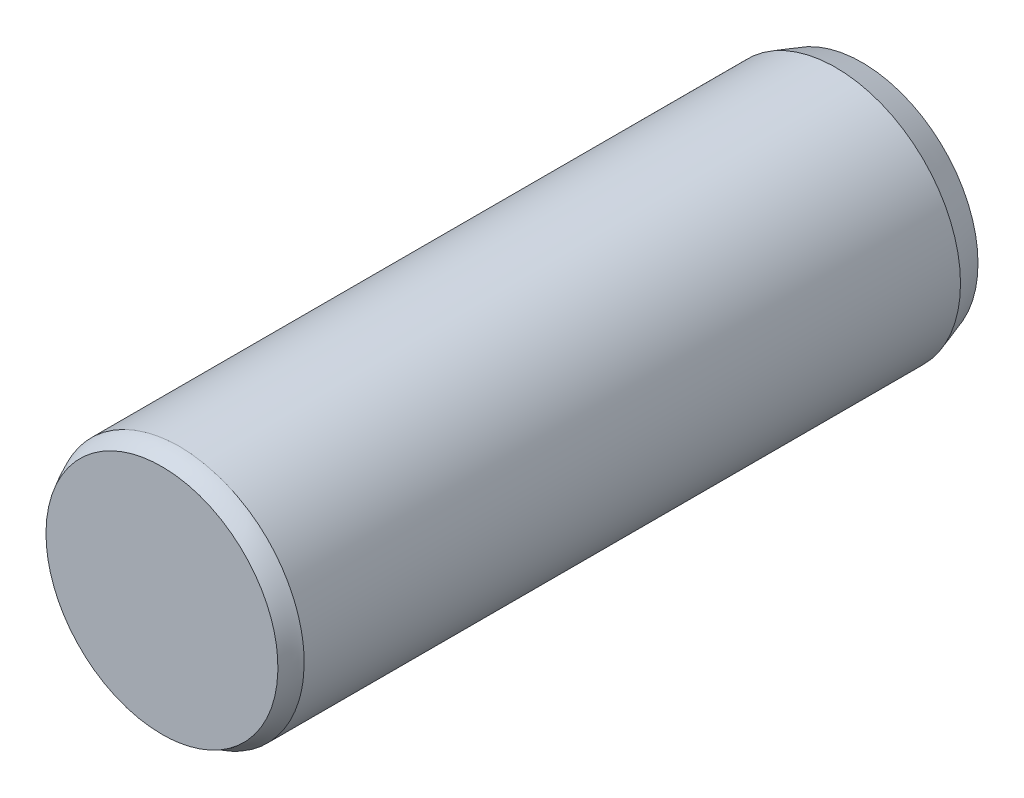
ISO-10303-21;
HEADER;
FILE_DESCRIPTION(('STEP AP214'),'2;1');
FILE_NAME('part.step','',(''),(''),'','','');
FILE_SCHEMA(('AUTOMOTIVE_DESIGN { 1 0 10303 214 1 1 1 1 }'));
ENDSEC;
DATA;
#1=APPLICATION_CONTEXT('core data for automotive mechanical design processes');
#2=APPLICATION_PROTOCOL_DEFINITION('international standard','automotive_design',2000,#1);
#3=PRODUCT_CONTEXT('',#1,'mechanical');
#4=PRODUCT('Part','Part','',(#3));
#5=PRODUCT_RELATED_PRODUCT_CATEGORY('part','',(#4));
#6=PRODUCT_DEFINITION_FORMATION('','',#4);
#7=PRODUCT_DEFINITION_CONTEXT('part definition',#1,'design');
#8=PRODUCT_DEFINITION('design','',#6,#7);
#9=PRODUCT_DEFINITION_SHAPE('','',#8);
#10=(LENGTH_UNIT() NAMED_UNIT(*) SI_UNIT(.MILLI.,.METRE.));
#11=(NAMED_UNIT(*) PLANE_ANGLE_UNIT() SI_UNIT($,.RADIAN.));
#12=(NAMED_UNIT(*) SI_UNIT($,.STERADIAN.) SOLID_ANGLE_UNIT());
#13=UNCERTAINTY_MEASURE_WITH_UNIT(LENGTH_MEASURE(1.E-05),#10,'distance_accuracy_value','');
#14=(GEOMETRIC_REPRESENTATION_CONTEXT(3) GLOBAL_UNCERTAINTY_ASSIGNED_CONTEXT((#13)) GLOBAL_UNIT_ASSIGNED_CONTEXT((#10,
#11,#12)) REPRESENTATION_CONTEXT('',''));
#15=CARTESIAN_POINT('',(0.,0.,0.));
#16=DIRECTION('',(0.,0.,1.));
#17=DIRECTION('',(1.,0.,0.));
#18=AXIS2_PLACEMENT_3D('',#15,#16,#17);
#19=CARTESIAN_POINT('',(0.,0.,-150.));
#20=DIRECTION('',(0.,0.,1.));
#21=DIRECTION('',(1.,0.,0.));
#22=AXIS2_PLACEMENT_3D('',#19,#20,#21);
#23=CYLINDRICAL_SURFACE('',#22,28.5);
#24=CARTESIAN_POINT('',(0.,0.,-150.));
#25=DIRECTION('',(0.,0.,1.));
#26=DIRECTION('',(1.,0.,0.));
#27=AXIS2_PLACEMENT_3D('',#24,#25,#26);
#28=CIRCLE('',#27,28.5);
#29=CARTESIAN_POINT('',(28.5,0.,-150.));
#30=VERTEX_POINT('',#29);
#31=EDGE_CURVE('E113',#30,#30,#28,.T.);
#32=ORIENTED_EDGE('',*,*,#31,.T.);
#33=EDGE_LOOP('',(#32));
#34=FACE_BOUND('',#33,.T.);
#35=CARTESIAN_POINT('',(0.,28.5,0.));
#36=CARTESIAN_POINT('',(0.685403881065248,28.4999974621461,-5.28809030770894E-06));
#37=CARTESIAN_POINT('',(1.3708806461371,28.475260016386,0.00306878781438999));
#38=CARTESIAN_POINT('',(2.73819556818574,28.3764373431519,0.0107953116492988));
#39=CARTESIAN_POINT('',(3.42003381571865,28.3023533496528,0.0154477201098152));
#40=CARTESIAN_POINT('',(4.77650699058129,28.1052411641767,0.0234275900641823));
#41=CARTESIAN_POINT('',(5.45114306351576,27.9822208789875,0.0267552654255539));
#42=CARTESIAN_POINT('',(6.7898044893632,27.687871657382,0.0308989835226916));
#43=CARTESIAN_POINT('',(7.45382974799033,27.5165422919517,0.0317150039526634));
#44=CARTESIAN_POINT('',(8.76774006291771,27.1264872074765,0.0308498409957288));
#45=CARTESIAN_POINT('',(9.41762647442937,26.9077660531653,0.0291688980228022));
#46=CARTESIAN_POINT('',(10.6999238813891,26.4240646643419,0.0240487922613334));
#47=CARTESIAN_POINT('',(11.3323352559646,26.15908543433,0.0206096676488127));
#48=CARTESIAN_POINT('',(12.5766301804993,25.5841399366828,0.0130210921716947));
#49=CARTESIAN_POINT('',(13.1885066702285,25.2741583877037,0.00887139993487579));
#50=CARTESIAN_POINT('',(14.3883580897187,24.6108747387459,0.000883238085759316));
#51=CARTESIAN_POINT('',(14.9763308669008,24.2575687487667,-0.00295520352859254));
#52=CARTESIAN_POINT('',(16.2219851637115,23.44650160723,-0.0101014731614439));
#53=CARTESIAN_POINT('',(16.8747554252676,22.9811667632607,-0.0132114322460841));
#54=CARTESIAN_POINT('',(18.1388368786517,21.9971430538108,-0.0174600333923661));
#55=CARTESIAN_POINT('',(18.7501436784115,21.4784485507426,-0.0185984669300947));
#56=CARTESIAN_POINT('',(19.9271148426963,20.3912263147817,-0.0190099804002163));
#57=CARTESIAN_POINT('',(20.4927632741799,19.8226813291138,-0.018282412046492));
#58=CARTESIAN_POINT('',(21.5741341374833,18.6399777333636,-0.015484100706862));
#59=CARTESIAN_POINT('',(22.0898578620115,18.0258203050597,-0.0134133925097851));
#60=CARTESIAN_POINT('',(23.0676102346926,16.7564032457231,-0.00866156773661857));
#61=CARTESIAN_POINT('',(23.5296523094503,16.1011539558015,-0.00598060429330979));
#62=CARTESIAN_POINT('',(24.3969112753053,14.754064451404,-0.000761097276273689));
#63=CARTESIAN_POINT('',(24.8021278305516,14.0622240207,0.00177744545566361));
#64=CARTESIAN_POINT('',(25.5528217553203,12.6469326901876,0.00609287156869941));
#65=CARTESIAN_POINT('',(25.8983041569792,11.9234844595282,0.00786981912691987));
#66=CARTESIAN_POINT('',(26.5271166551266,10.4500546586747,0.0102909892598974));
#67=CARTESIAN_POINT('',(26.810446856752,9.7000731333669,0.0109352137507864));
#68=CARTESIAN_POINT('',(27.3130050128885,8.17873996526786,0.0110404191295344));
#69=CARTESIAN_POINT('',(27.5322158642367,7.40738268067386,0.0105010846410658));
#70=CARTESIAN_POINT('',(27.9048900102245,5.84883443670751,0.00855514134294157));
#71=CARTESIAN_POINT('',(28.0583532190186,5.06164345666283,0.00714853140090808));
#72=CARTESIAN_POINT('',(28.2383937511249,3.87347338325476,0.00491906670587249));
#73=CARTESIAN_POINT('',(28.2900513614211,3.47613859891996,0.00415588938062412));
#74=CARTESIAN_POINT('',(28.3765760952044,2.67961746284959,0.00271877019072627));
#75=CARTESIAN_POINT('',(28.4114432182169,2.28043111106168,0.00204482832859924));
#76=CARTESIAN_POINT('',(28.4643162120759,1.48095018141888,0.000916800894629713));
#77=CARTESIAN_POINT('',(28.4823221006724,1.08065560473109,0.000462715091342802));
#78=CARTESIAN_POINT('',(28.501443423147,0.279663007348349,-2.03338944380448E-05));
#79=CARTESIAN_POINT('',(28.5025588598098,-0.121035013280067,-4.92971470229159E-05));
#80=CARTESIAN_POINT('',(28.4878948151195,-0.922128409069801,0.000306665889575886));
#81=CARTESIAN_POINT('',(28.4721153311851,-1.32252378418487,0.000691592241995964));
#82=CARTESIAN_POINT('',(28.4236966521833,-2.12226630422581,0.00161656094045279));
#83=CARTESIAN_POINT('',(28.3910574537554,-2.52161344894274,0.0021566033174075));
#84=CARTESIAN_POINT('',(28.2679165067008,-3.71703318340813,0.00378569926704658));
#85=CARTESIAN_POINT('',(28.1521881260104,-4.51066214766737,0.00488395692428992));
#86=CARTESIAN_POINT('',(27.854301129016,-6.08524089672407,0.00643144747453043));
#87=CARTESIAN_POINT('',(27.6721425779645,-6.86619069397512,0.00688068100504373));
#88=CARTESIAN_POINT('',(27.2426826982211,-8.40999878134976,0.00702411960966533));
#89=CARTESIAN_POINT('',(26.9953813752433,-9.17285707306023,0.00671832475000086));
#90=CARTESIAN_POINT('',(26.4373908705409,-10.675035765523,0.00553438790933401));
#91=CARTESIAN_POINT('',(26.1267004713626,-11.4143557138815,0.00465623493488156));
#92=CARTESIAN_POINT('',(25.4441429843474,-12.8641966578449,0.00264495364370522));
#93=CARTESIAN_POINT('',(25.0722758913117,-13.5747176510026,0.00151182530531353));
#94=CARTESIAN_POINT('',(24.2700087153768,-14.9619070581768,-0.000683461709526115));
#95=CARTESIAN_POINT('',(23.8396086414295,-15.6385754773705,-0.00174562039682781));
#96=CARTESIAN_POINT('',(22.9233350194986,-16.9532501874318,-0.00353979288168504));
#97=CARTESIAN_POINT('',(22.4374614753456,-17.5912564809691,-0.00427180670203738));
#98=CARTESIAN_POINT('',(21.4136879140966,-18.8240795359476,-0.00525298213965907));
#99=CARTESIAN_POINT('',(20.8757871757562,-19.4188956984511,-0.005502137062129));
#100=CARTESIAN_POINT('',(19.7517892013451,-20.5610997708183,-0.00548968404546693));
#101=CARTESIAN_POINT('',(19.1656919635653,-21.1084876790004,-0.00522807608822343));
#102=CARTESIAN_POINT('',(17.9494674424314,-22.151943921568,-0.00428461917573095));
#103=CARTESIAN_POINT('',(17.3193401220561,-22.6480122128024,-0.00360276986713219));
#104=CARTESIAN_POINT('',(16.019535887199,-23.585302036119,-0.00200464108796319));
#105=CARTESIAN_POINT('',(15.3498589715338,-24.0265235665602,-0.0010883616103787));
#106=CARTESIAN_POINT('',(13.9757241634628,-24.850978147343,0.000737170520839549));
#107=CARTESIAN_POINT('',(13.2712667028398,-25.2342119173333,0.00164642326154469));
#108=CARTESIAN_POINT('',(11.8325737264031,-25.939972938931,0.00321051994396546));
#109=CARTESIAN_POINT('',(11.0983382124999,-26.2625001944332,0.00386536390200379));
#110=CARTESIAN_POINT('',(9.60529914767628,-26.8445558344821,0.00472580555283739));
#111=CARTESIAN_POINT('',(8.84649560509413,-27.1040842404101,0.00493140339810347));
#112=CARTESIAN_POINT('',(7.30975226536153,-27.5582945474583,0.00482320381532672));
#113=CARTESIAN_POINT('',(6.53181246722908,-27.7529764452509,0.00450940636063055));
#114=CARTESIAN_POINT('',(4.96218805299292,-28.0761194818821,0.00348287213962232));
#115=CARTESIAN_POINT('',(4.17050343337944,-28.204580603811,0.00277013527143886));
#116=CARTESIAN_POINT('',(2.97719026560795,-28.3469049936311,0.00169970787524368));
#117=CARTESIAN_POINT('',(2.57841023972814,-28.3859534461908,0.00134263867627373));
#118=CARTESIAN_POINT('',(1.77953140268056,-28.4472089208759,0.000707392730416157));
#119=CARTESIAN_POINT('',(1.3794325915694,-28.4694159437243,0.000429215980141506));
#120=CARTESIAN_POINT('',(0.578661061860506,-28.496941402032,6.01587263595306E-05));
#121=CARTESIAN_POINT('',(0.17798834315843,-28.5022598344209,-3.07217430962851E-05));
#122=CARTESIAN_POINT('',(-0.623225090272998,-28.4960012288696,5.8699023284112E-05));
#123=CARTESIAN_POINT('',(-1.02376580499904,-28.4844241905062,0.000239000265912911));
#124=CARTESIAN_POINT('',(-1.82400975041795,-28.4443925404426,0.000734962841306362));
#125=CARTESIAN_POINT('',(-2.22371298088533,-28.4159379241988,0.00105062421051025));
#126=CARTESIAN_POINT('',(-3.02153773100344,-28.3422099047203,0.00173280089423739));
#127=CARTESIAN_POINT('',(-3.41965925064051,-28.2969365013402,0.00209931620919997));
#128=CARTESIAN_POINT('',(-4.61060618056108,-28.1359872888811,0.00316185544836989));
#129=CARTESIAN_POINT('',(-5.40018998444939,-27.9951736516542,0.00382104956514299));
#130=CARTESIAN_POINT('',(-6.96457985411879,-27.6475479464051,0.00470042277674416));
#131=CARTESIAN_POINT('',(-7.73938592295678,-27.4407358920352,0.00492060196238673));
#132=CARTESIAN_POINT('',(-9.26885087174988,-26.9625717384315,0.00484196311103194));
#133=CARTESIAN_POINT('',(-10.0235097529269,-26.6912196431119,0.00454314510551107));
#134=CARTESIAN_POINT('',(-11.5072779325296,-26.0859078047116,0.00352512780904969));
#135=CARTESIAN_POINT('',(-12.2363872276995,-25.7519480536532,0.00280592846454153));
#136=CARTESIAN_POINT('',(-13.6638791258634,-25.0237961832819,0.00115703938767315));
#137=CARTESIAN_POINT('',(-14.3622618863063,-24.6296043726564,0.000227350734051827));
#138=CARTESIAN_POINT('',(-15.7233373400584,-23.7837896334507,-0.00159243241438313));
#139=CARTESIAN_POINT('',(-16.386030034706,-23.332166707024,-0.00248252691068137));
#140=CARTESIAN_POINT('',(-17.6710148211845,-22.3747003446988,-0.0039882269897548));
#141=CARTESIAN_POINT('',(-18.2933069290686,-21.8688569303452,-0.00460383268159909));
#142=CARTESIAN_POINT('',(-19.4930665658595,-20.8065455645557,-0.00538997162560128));
#143=CARTESIAN_POINT('',(-20.070534096004,-20.2500776145176,-0.00556050489004765));
#144=CARTESIAN_POINT('',(-21.1765446807768,-19.0904675314525,-0.00538662057551987));
#145=CARTESIAN_POINT('',(-21.7050872423714,-18.4873249281814,-0.00504219780775694));
#146=CARTESIAN_POINT('',(-22.709483595908,-17.2386585747463,-0.00388947554231524));
#147=CARTESIAN_POINT('',(-23.185337386478,-16.5931348234788,-0.00308117603255885));
#148=CARTESIAN_POINT('',(-24.0809732574373,-15.2642956773149,-0.00117540020448283));
#149=CARTESIAN_POINT('',(-24.5007553387247,-14.5809802830237,-7.79238907946162E-05));
#150=CARTESIAN_POINT('',(-25.2812637517865,-13.1814147014148,0.00213113236883107));
#151=CARTESIAN_POINT('',(-25.6419900768914,-12.4651645103776,0.00324271231636133));
#152=CARTESIAN_POINT('',(-26.3018227217191,-11.0048229617734,0.00514839845552475));
#153=CARTESIAN_POINT('',(-26.6009289900373,-10.2607315809814,0.00594250438231529));
#154=CARTESIAN_POINT('',(-27.1353949220544,-8.74998887919031,0.00690981869674036));
#155=CARTESIAN_POINT('',(-27.3707546085095,-7.98333756624482,0.00708302730602175));
#156=CARTESIAN_POINT('',(-27.7760525210235,-6.43296096764245,0.00666698426613177));
#157=CARTESIAN_POINT('',(-27.9459907228605,-5.64923567566416,0.00607773233466484));
#158=CARTESIAN_POINT('',(-28.2192434303303,-4.07015075132147,0.00432220772225419));
#159=CARTESIAN_POINT('',(-28.3225579103609,-3.27479111448635,0.00315593481957317));
#160=CARTESIAN_POINT('',(-28.4270014658443,-2.07755677460706,0.00157024884086503));
#161=CARTESIAN_POINT('',(-28.4533947367193,-1.67773887528735,0.00106893166850693));
#162=CARTESIAN_POINT('',(-28.4893092930903,-0.877345814796845,0.000297905050570367));
#163=CARTESIAN_POINT('',(-28.4988305832954,-0.476770653837447,2.81955403469866E-05));
#164=CARTESIAN_POINT('',(-28.5020333644254,0.724990839771501,-4.75592508353393E-05));
#165=CARTESIAN_POINT('',(-28.4703692924561,1.52639141051225,0.000879322721752227));
#166=CARTESIAN_POINT('',(-28.339646217989,3.123569632623,0.00341861926491089));
#167=CARTESIAN_POINT('',(-28.2405872630281,3.91934728795872,0.00503103335194254));
#168=CARTESIAN_POINT('',(-27.9757844736171,5.4997582304703,0.00792924368855593));
#169=CARTESIAN_POINT('',(-27.8100406305835,6.2843915162117,0.00921503989609647));
#170=CARTESIAN_POINT('',(-27.4130464066524,7.83689235166645,0.0108338030761368));
#171=CARTESIAN_POINT('',(-27.1817967030836,8.60476007464686,0.0111667799003688));
#172=CARTESIAN_POINT('',(-26.6554347227463,10.1182875512507,0.0106306307348382));
#173=CARTESIAN_POINT('',(-26.3603224454033,10.8639473046744,0.00976150473426166));
#174=CARTESIAN_POINT('',(-25.7083352723945,12.3277512848379,0.00693686122330121));
#175=CARTESIAN_POINT('',(-25.3514606082457,13.0458956147072,0.00498134778519162));
#176=CARTESIAN_POINT('',(-24.5784853711175,14.4495675473832,0.000407409590688822));
#177=CARTESIAN_POINT('',(-24.1623847957666,15.1350951488837,-0.00221101519225023));
#178=CARTESIAN_POINT('',(-23.2739403724336,16.4686238496584,-0.00745574195681786));
#179=CARTESIAN_POINT('',(-22.8015997440101,17.1166270939252,-0.0100820434791465));
#180=CARTESIAN_POINT('',(-21.8040114587086,18.3705459300267,-0.0145806850132791));
#181=CARTESIAN_POINT('',(-21.2787637576836,18.9764614867415,-0.0164530243959516));
#182=CARTESIAN_POINT('',(-20.1790742401953,20.1419187013816,-0.0187355550939362));
#183=CARTESIAN_POINT('',(-19.6046305998584,20.7014586384781,-0.019145692176004));
#184=CARTESIAN_POINT('',(-18.4106542592701,21.7701567897037,-0.018042082599158));
#185=CARTESIAN_POINT('',(-17.7911217850772,22.2793152563962,-0.0165283455851963));
#186=CARTESIAN_POINT('',(-16.5113949702036,23.2436168136451,-0.0115695184839835));
#187=CARTESIAN_POINT('',(-15.8512018495698,23.6987615237181,-0.00812448632128479));
#188=CARTESIAN_POINT('',(-14.4948111831203,24.5518290738995,7.75249709715691E-05));
#189=CARTESIAN_POINT('',(-13.7986129622678,24.9497508406421,0.00483452870510211));
#190=CARTESIAN_POINT('',(-12.3753263735068,25.6854631871184,0.0142684643054668));
#191=CARTESIAN_POINT('',(-11.6482437581587,26.0232649045712,0.0189454108575261));
#192=CARTESIAN_POINT('',(-10.1681707731303,26.6364355980971,0.0264982686552845));
#193=CARTESIAN_POINT('',(-9.41518221135885,26.911808920748,0.0293743053139434));
#194=CARTESIAN_POINT('',(-8.18662658908933,27.3032596450611,0.0314286379267289));
#195=CARTESIAN_POINT('',(-7.71740453053877,27.4395764136435,0.0316116536932795));
#196=CARTESIAN_POINT('',(-6.77257034857697,27.6879178883049,0.0306689732989206));
#197=CARTESIAN_POINT('',(-6.2969585600156,27.7999438620957,0.0295433454542941));
#198=CARTESIAN_POINT('',(-5.34061906008541,27.9994001048008,0.0260869268577424));
#199=CARTESIAN_POINT('',(-4.85989135871849,28.0868304217919,0.0237561384615522));
#200=CARTESIAN_POINT('',(-3.89473109144916,28.2368465336418,0.0183302118852423));
#201=CARTESIAN_POINT('',(-3.4102997179612,28.299440007708,0.0152353104391334));
#202=CARTESIAN_POINT('',(-2.43885625804238,28.3996549971367,0.00913931395806854));
#203=CARTESIAN_POINT('',(-1.95184417416688,28.4372765372211,0.00613821883024802));
#204=CARTESIAN_POINT('',(-0.976567011812671,28.4874492673192,0.00157048418788407));
#205=CARTESIAN_POINT('',(-0.488302002260591,28.5000018080422,3.7673919811717E-06));
#206=CARTESIAN_POINT('',(0.,28.5,0.));
#207=B_SPLINE_CURVE_WITH_KNOTS('',3,(#35,#36,#37,#38,#39,#40,#41,#42,#43,#44,#45,#46,#47,#48,
#49,#50,#51,#52,#53,#54,#55,#56,#57,#58,#59,#60,#61,#62,#63,#64,#65,#66,#67,#68,#69,#70,#71,#72,
#73,#74,#75,#76,#77,#78,#79,#80,#81,#82,#83,#84,#85,#86,#87,#88,#89,#90,#91,#92,#93,#94,#95,#96,
#97,#98,#99,#100,#101,#102,#103,#104,#105,#106,#107,#108,#109,#110,#111,#112,#113,#114,#115,
#116,#117,#118,#119,#120,#121,#122,#123,#124,#125,#126,#127,#128,#129,#130,#131,#132,#133,#134,
#135,#136,#137,#138,#139,#140,#141,#142,#143,#144,#145,#146,#147,#148,#149,#150,#151,#152,#153,
#154,#155,#156,#157,#158,#159,#160,#161,#162,#163,#164,#165,#166,#167,#168,#169,#170,#171,#172,
#173,#174,#175,#176,#177,#178,#179,#180,#181,#182,#183,#184,#185,#186,#187,#188,#189,#190,#191,
#192,#193,#194,#195,#196,#197,#198,#199,#200,#201,#202,#203,#204,#205,#206),.UNSPECIFIED.,.T.,
.F.,(4,2,2,2,2,2,2,2,2,2,2,2,2,2,2,2,2,2,2,2,2,2,2,2,2,2,2,2,2,2,2,2,2,2,2,2,2,2,2,2,2,2,2,2,2,
2,2,2,2,2,2,2,2,2,2,2,2,2,2,2,2,2,2,2,2,2,2,2,2,2,2,2,2,2,2,2,2,2,2,2,2,2,2,2,2,4),(0.,
2.05589603840555,4.11174066837516,6.16725326400992,8.22278411442499,10.2781170659355,
12.333405391168,14.3893932658996,16.4455658783405,18.8476154510597,21.2499190677568,
23.6530574054906,26.0561335017307,28.4586072519048,30.8610952006133,33.2633806597366,
35.6656620551126,38.0685836506727,40.4715083836686,41.6732554228435,42.8750024959887,
44.0767483040414,45.2784939139596,46.4802397074873,47.6819857405489,50.084945192691,
52.4879022844795,54.890859165493,57.2938622021637,59.6968654430415,62.099868316415,
64.5028710238589,66.9059070485019,69.3089431583558,71.7119812887472,74.1150194910386,
76.5180278683264,78.9210360914385,81.3240434989874,83.7270510298491,86.1300591743326,
87.331830135408,88.5336010448887,89.735372172858,90.9371433309293,92.1389148125202,
93.3406863044931,95.7437022390568,98.1467176765332,100.54973296827,102.952748566214,
105.355751849197,107.758755042077,110.161757280114,112.564759451804,114.967785836735,
117.370812284232,119.773838693243,122.17686537364,124.579894058682,126.982921885895,
129.385950602811,131.788980243163,132.990738112441,134.192495646291,136.5954757314,
138.998454121572,141.401432821047,143.804386674693,146.207340549955,148.610285417914,
151.013230382097,153.416037851648,155.818847326178,158.221745920249,160.624632467924,
163.027446950652,165.430306498568,167.832720433151,170.234967048224,171.700261314311,
173.165479089775,174.63069400118,176.095455534787,177.56021561829,179.024896778882),.UNSPECIFIED.);
#208=CARTESIAN_POINT('',(0.,28.5,0.));
#209=VERTEX_POINT('',#208);
#210=EDGE_CURVE('E83',#209,#209,#207,.F.);
#211=ORIENTED_EDGE('',*,*,#210,.F.);
#212=EDGE_LOOP('',(#211));
#213=FACE_BOUND('',#212,.T.);
#214=ADVANCED_FACE('F78',(#34,#213),#23,.T.);
#215=CARTESIAN_POINT('',(0.,-28.5492821570129,-0.042231989653493));
#216=CARTESIAN_POINT('',(0.,-28.5328547713419,-0.0281546597689953));
#217=CARTESIAN_POINT('',(0.,-28.516427385671,-0.0140773298844977));
#218=CARTESIAN_POINT('',(0.,-28.5,0.));
#219=CARTESIAN_POINT('',(0.,-27.3219123629589,1.0095537191162));
#220=CARTESIAN_POINT('',(0.,-26.6007903930683,2.45179765889738));
#221=CARTESIAN_POINT('',(0.,-26.5,4.));
#222=CARTESIAN_POINT('',(0.787248485598303,-28.5492821570129,-0.042231989653493));
#223=CARTESIAN_POINT('',(0.786991953445671,-28.5328547713419,-0.0281546597689953));
#224=CARTESIAN_POINT('',(0.786735421293038,-28.516427385671,-0.0140773298844977));
#225=CARTESIAN_POINT('',(0.786478889140406,-28.5,0.));
#226=CARTESIAN_POINT('',(0.768081722142978,-27.3219123629589,1.0095537191162));
#227=CARTESIAN_POINT('',(0.749684555145542,-26.6007903930683,2.45179765889738));
#228=CARTESIAN_POINT('',(0.731287388148096,-26.5,4.));
#229=CARTESIAN_POINT('',(2.34693520079284,-28.4853675644551,-0.042231989653493));
#230=CARTESIAN_POINT('',(2.34617043039294,-28.4689610059414,-0.0281546597689953));
#231=CARTESIAN_POINT('',(2.34540565999305,-28.4525544474277,-0.0140773298844977));
#232=CARTESIAN_POINT('',(2.34464088959315,-28.436147888914,0.));
#233=CARTESIAN_POINT('',(2.28979548866701,-27.2595538685065,1.0095537191162));
#234=CARTESIAN_POINT('',(2.23495008774085,-26.5399255152495,2.45179765889738));
#235=CARTESIAN_POINT('',(2.18010468681468,-26.4406287388148,4.));
#236=CARTESIAN_POINT('',(4.63466885509504,-28.2051175484286,-0.042231989653493));
#237=CARTESIAN_POINT('',(4.63315860566315,-28.1888023119577,-0.0281546597689953));
#238=CARTESIAN_POINT('',(4.63164835623125,-28.1724870754868,-0.0140773298844977));
#239=CARTESIAN_POINT('',(4.63013810679935,-28.1561718390159,0.));
#240=CARTESIAN_POINT('',(4.5218307826637,-26.9861269659744,1.0095537191162));
#241=CARTESIAN_POINT('',(4.41352345852805,-26.2730477600835,2.45179765889738));
#242=CARTESIAN_POINT('',(4.30521613439238,-26.1803001310148,4.));
#243=CARTESIAN_POINT('',(6.86324044042429,-27.7478550556956,-0.042231989653493));
#244=CARTESIAN_POINT('',(6.86100399046417,-27.7316888224095,-0.0281546597689953));
#245=CARTESIAN_POINT('',(6.85876754050406,-27.7155225891234,-0.0140773298844977));
#246=CARTESIAN_POINT('',(6.85653109054394,-27.6993563558373,0.));
#247=CARTESIAN_POINT('',(6.69614439836748,-26.5399972250923,1.0095537191162));
#248=CARTESIAN_POINT('',(6.53575770619102,-25.837603761498,2.45179765889738));
#249=CARTESIAN_POINT('',(6.37537101401454,-25.7555418747259,4.));
#250=CARTESIAN_POINT('',(19.8355036356619,-23.9863991419583,-0.042231989653493));
#251=CARTESIAN_POINT('',(19.8290400545445,-23.9714586136437,-0.0281546597689953));
#252=CARTESIAN_POINT('',(19.8225764734271,-23.9565180853291,-0.0140773298844977));
#253=CARTESIAN_POINT('',(19.8161128923097,-23.9415775570144,0.));
#254=CARTESIAN_POINT('',(19.3525780878112,-22.8701196847215,1.0095537191162));
#255=CARTESIAN_POINT('',(18.8890432833127,-22.2556274795791,2.45179765889738));
#256=CARTESIAN_POINT('',(18.4255084788143,-22.261466851259,4.));
#257=CARTESIAN_POINT('',(28.5278882235149,-12.617369703071,-0.042231989653493));
#258=CARTESIAN_POINT('',(28.5185921490099,-12.6061338774629,-0.0281546597689953));
#259=CARTESIAN_POINT('',(28.509296074505,-12.5948980518548,-0.0140773298844977));
#260=CARTESIAN_POINT('',(28.5,-12.5836622262467,0.));
#261=CARTESIAN_POINT('',(27.8333333333333,-11.7778865839132,1.0095537191162));
#262=CARTESIAN_POINT('',(27.1666666666667,-11.4290766087303,2.45179765889738));
#263=CARTESIAN_POINT('',(26.5,-11.7005982103697,4.));
#264=CARTESIAN_POINT('',(28.5278882235149,15.7235757784683,-0.042231989653493));
#265=CARTESIAN_POINT('',(28.5185921490099,15.7255764465816,-0.0281546597689953));
#266=CARTESIAN_POINT('',(28.509296074505,15.727577114695,-0.0140773298844977));
#267=CARTESIAN_POINT('',(28.5,15.7295777828083,0.));
#268=CARTESIAN_POINT('',(27.8333333333333,15.8730554132341,1.0095537191162));
#269=CARTESIAN_POINT('',(27.1666666666667,15.5595673765093,2.45179765889738));
#270=CARTESIAN_POINT('',(26.5,14.6257477629621,4.));
#271=CARTESIAN_POINT('',(15.7449697119663,28.5064942900169,-0.042231989653493));
#272=CARTESIAN_POINT('',(15.7398390689137,28.5043295266779,-0.0281546597689953));
#273=CARTESIAN_POINT('',(15.734708425861,28.502164763339,-0.0140773298844977));
#274=CARTESIAN_POINT('',(15.7295777828084,28.5,0.));
#275=CARTESIAN_POINT('',(15.3616344428596,28.3447543037078,1.0095537191162));
#276=CARTESIAN_POINT('',(14.9936911029109,27.732542940265,2.45179765889738));
#277=CARTESIAN_POINT('',(14.6257477629622,26.5,4.));
#278=CARTESIAN_POINT('',(-15.7449697119663,28.5064942900169,-0.042231989653493));
#279=CARTESIAN_POINT('',(-15.7398390689136,28.5043295266779,-0.0281546597689953));
#280=CARTESIAN_POINT('',(-15.734708425861,28.502164763339,-0.0140773298844977));
#281=CARTESIAN_POINT('',(-15.7295777828083,28.5,0.));
#282=CARTESIAN_POINT('',(-15.3616344428596,28.3447543037078,1.0095537191162));
#283=CARTESIAN_POINT('',(-14.9936911029109,27.7325429402651,2.45179765889738));
#284=CARTESIAN_POINT('',(-14.6257477629621,26.5,4.));
#285=CARTESIAN_POINT('',(-28.5278882235149,15.7235757784683,-0.042231989653493));
#286=CARTESIAN_POINT('',(-28.5185921490099,15.7255764465817,-0.0281546597689953));
#287=CARTESIAN_POINT('',(-28.509296074505,15.727577114695,-0.0140773298844977));
#288=CARTESIAN_POINT('',(-28.5,15.7295777828084,0.));
#289=CARTESIAN_POINT('',(-27.8333333333333,15.8730554132341,1.0095537191162));
#290=CARTESIAN_POINT('',(-27.1666666666666,15.5595673765093,2.45179765889738));
#291=CARTESIAN_POINT('',(-26.5,14.6257477629622,4.));
#292=CARTESIAN_POINT('',(-28.5278882235149,-12.617369703071,-0.042231989653493));
#293=CARTESIAN_POINT('',(-28.5185921490099,-12.6061338774629,-0.0281546597689953));
#294=CARTESIAN_POINT('',(-28.509296074505,-12.5948980518548,-0.0140773298844977));
#295=CARTESIAN_POINT('',(-28.5,-12.5836622262467,0.));
#296=CARTESIAN_POINT('',(-27.8333333333333,-11.7778865839132,1.0095537191162));
#297=CARTESIAN_POINT('',(-27.1666666666667,-11.4290766087303,2.45179765889738));
#298=CARTESIAN_POINT('',(-26.5,-11.7005982103697,4.));
#299=CARTESIAN_POINT('',(-19.8355036356619,-23.9863991419583,-0.042231989653493));
#300=CARTESIAN_POINT('',(-19.8290400545445,-23.9714586136437,-0.0281546597689953));
#301=CARTESIAN_POINT('',(-19.8225764734271,-23.9565180853291,-0.0140773298844977));
#302=CARTESIAN_POINT('',(-19.8161128923097,-23.9415775570144,0.));
#303=CARTESIAN_POINT('',(-19.3525780878112,-22.8701196847215,1.0095537191162));
#304=CARTESIAN_POINT('',(-18.8890432833127,-22.2556274795791,2.45179765889738));
#305=CARTESIAN_POINT('',(-18.4255084788143,-22.261466851259,4.));
#306=CARTESIAN_POINT('',(-6.8632404404243,-27.7478550556956,-0.042231989653493));
#307=CARTESIAN_POINT('',(-6.86100399046419,-27.7316888224095,-0.0281546597689953));
#308=CARTESIAN_POINT('',(-6.85876754050407,-27.7155225891234,-0.0140773298844977));
#309=CARTESIAN_POINT('',(-6.85653109054396,-27.6993563558373,0.));
#310=CARTESIAN_POINT('',(-6.69614439836748,-26.5399972250923,1.0095537191162));
#311=CARTESIAN_POINT('',(-6.53575770619102,-25.837603761498,2.45179765889738));
#312=CARTESIAN_POINT('',(-6.37537101401456,-25.7555418747259,4.));
#313=CARTESIAN_POINT('',(-4.63466885509506,-28.2051175484286,-0.042231989653493));
#314=CARTESIAN_POINT('',(-4.63315860566317,-28.1888023119577,-0.0281546597689953));
#315=CARTESIAN_POINT('',(-4.63164835623127,-28.1724870754868,-0.0140773298844977));
#316=CARTESIAN_POINT('',(-4.63013810679937,-28.1561718390159,0.));
#317=CARTESIAN_POINT('',(-4.5218307826637,-26.9861269659744,1.0095537191162));
#318=CARTESIAN_POINT('',(-4.41352345852805,-26.2730477600835,2.45179765889738));
#319=CARTESIAN_POINT('',(-4.3052161343924,-26.1803001310148,4.));
#320=CARTESIAN_POINT('',(-2.34693520079286,-28.4853675644551,-0.042231989653493));
#321=CARTESIAN_POINT('',(-2.34617043039297,-28.4689610059414,-0.0281546597689953));
#322=CARTESIAN_POINT('',(-2.34540565999307,-28.4525544474277,-0.0140773298844977));
#323=CARTESIAN_POINT('',(-2.34464088959318,-28.436147888914,0.));
#324=CARTESIAN_POINT('',(-2.28979548866701,-27.2595538685065,1.0095537191162));
#325=CARTESIAN_POINT('',(-2.23495008774086,-26.5399255152495,2.45179765889738));
#326=CARTESIAN_POINT('',(-2.18010468681471,-26.4406287388148,4.));
#327=CARTESIAN_POINT('',(-0.787248485598322,-28.5492821570129,-0.042231989653493));
#328=CARTESIAN_POINT('',(-0.786991953445689,-28.5328547713419,-0.0281546597689953));
#329=CARTESIAN_POINT('',(-0.786735421293056,-28.516427385671,-0.0140773298844977));
#330=CARTESIAN_POINT('',(-0.786478889140423,-28.5,0.));
#331=CARTESIAN_POINT('',(-0.768081722142978,-27.3219123629589,1.0095537191162));
#332=CARTESIAN_POINT('',(-0.749684555145542,-26.6007903930683,2.45179765889738));
#333=CARTESIAN_POINT('',(-0.731287388148115,-26.5,4.));
#334=CARTESIAN_POINT('',(0.,-28.5492821570129,-0.042231989653493));
#335=CARTESIAN_POINT('',(0.,-28.5328547713419,-0.0281546597689953));
#336=CARTESIAN_POINT('',(0.,-28.516427385671,-0.0140773298844977));
#337=CARTESIAN_POINT('',(0.,-28.5,0.));
#338=CARTESIAN_POINT('',(0.,-27.3219123629589,1.0095537191162));
#339=CARTESIAN_POINT('',(0.,-26.6007903930683,2.45179765889738));
#340=CARTESIAN_POINT('',(0.,-26.5,4.));
#341=B_SPLINE_SURFACE_WITH_KNOTS('',3,3,((#215,#216,#217,#218,#219,#220,#221),(#222,#223,#224,
#225,#226,#227,#228),(#229,#230,#231,#232,#233,#234,#235),(#236,#237,#238,#239,#240,#241,#242),
(#243,#244,#245,#246,#247,#248,#249),(#250,#251,#252,#253,#254,#255,#256),(#257,#258,#259,#260,
#261,#262,#263),(#264,#265,#266,#267,#268,#269,#270),(#271,#272,#273,#274,#275,#276,#277),(#278,
#279,#280,#281,#282,#283,#284),(#285,#286,#287,#288,#289,#290,#291),(#292,#293,#294,#295,#296,
#297,#298),(#299,#300,#301,#302,#303,#304,#305),(#306,#307,#308,#309,#310,#311,#312),(#313,#314,
#315,#316,#317,#318,#319),(#320,#321,#322,#323,#324,#325,#326),(#327,#328,#329,#330,#331,#332,
#333),(#334,#335,#336,#337,#338,#339,#340)),.UNSPECIFIED.,.T.,.F.,.F.,(4,1,1,1,1,2,2,2,1,1,1,1,
4),(4,3,4),(0.,0.0125,0.0249999999999999,0.0375000000000001,0.05,0.25,0.5,0.75,0.95,0.9625,
0.975,0.9875,1.),(-0.0139441117574421,0.,1.),.UNSPECIFIED.);
#342=CARTESIAN_POINT('',(0.,-26.5,4.));
#343=CARTESIAN_POINT('',(-0.731287388148115,-26.5,4.));
#344=CARTESIAN_POINT('',(-2.18010468681471,-26.4406287388148,4.));
#345=CARTESIAN_POINT('',(-4.3052161343924,-26.1803001310148,4.));
#346=CARTESIAN_POINT('',(-6.37537101401456,-25.7555418747259,4.));
#347=CARTESIAN_POINT('',(-18.4255084788143,-22.261466851259,4.));
#348=CARTESIAN_POINT('',(-26.5,-11.7005982103697,4.));
#349=CARTESIAN_POINT('',(-26.5,14.6257477629622,4.));
#350=CARTESIAN_POINT('',(-14.6257477629621,26.5,4.));
#351=CARTESIAN_POINT('',(14.6257477629622,26.5,4.));
#352=CARTESIAN_POINT('',(26.5,14.6257477629621,4.));
#353=CARTESIAN_POINT('',(26.5,-11.7005982103697,4.));
#354=CARTESIAN_POINT('',(18.4255084788143,-22.261466851259,4.));
#355=CARTESIAN_POINT('',(6.37537101401454,-25.7555418747259,4.));
#356=CARTESIAN_POINT('',(4.30521613439238,-26.1803001310148,4.));
#357=CARTESIAN_POINT('',(2.18010468681468,-26.4406287388148,4.));
#358=CARTESIAN_POINT('',(0.731287388148096,-26.5,4.));
#359=CARTESIAN_POINT('',(0.,-26.5,4.));
#360=B_SPLINE_CURVE_WITH_KNOTS('',3,(#342,#343,#344,#345,#346,#347,#348,#349,#350,#351,#352,
#353,#354,#355,#356,#357,#358,#359),.UNSPECIFIED.,.T.,.F.,(4,1,1,1,1,2,2,2,1,1,1,1,4),(0.,
0.0125,0.025,0.0375,0.05,0.25,0.5,0.75,0.95,0.9625,0.975,0.9875,1.),.UNSPECIFIED.);
#361=CARTESIAN_POINT('',(0.,-26.5,4.));
#362=VERTEX_POINT('',#361);
#363=EDGE_CURVE('E96',#362,#362,#360,.T.);
#364=ORIENTED_EDGE('',*,*,#210,.T.);
#365=EDGE_LOOP('',(#364));
#366=FACE_BOUND('',#365,.T.);
#367=ORIENTED_EDGE('',*,*,#363,.T.);
#368=EDGE_LOOP('',(#367));
#369=FACE_BOUND('',#368,.T.);
#370=ADVANCED_FACE('F129',(#366,#369),#341,.T.);
#371=CARTESIAN_POINT('',(0.,0.,4.));
#372=DIRECTION('',(0.,0.,1.));
#373=DIRECTION('',(1.,0.,0.));
#374=AXIS2_PLACEMENT_3D('',#371,#372,#373);
#375=PLANE('',#374);
#376=ORIENTED_EDGE('',*,*,#363,.F.);
#377=EDGE_LOOP('',(#376));
#378=FACE_BOUND('',#377,.T.);
#379=ADVANCED_FACE('F80',(#378),#375,.T.);
#380=CARTESIAN_POINT('',(0.,0.,-156.));
#381=DIRECTION('',(0.,0.,1.));
#382=DIRECTION('',(1.,0.,0.));
#383=AXIS2_PLACEMENT_3D('',#380,#381,#382);
#384=CONICAL_SURFACE('',#383,26.5,0.321750554396642);
#385=ORIENTED_EDGE('',*,*,#31,.F.);
#386=EDGE_LOOP('',(#385));
#387=FACE_BOUND('',#386,.T.);
#388=CARTESIAN_POINT('',(0.,0.,-156.));
#389=DIRECTION('',(0.,0.,1.));
#390=DIRECTION('',(1.,0.,0.));
#391=AXIS2_PLACEMENT_3D('',#388,#389,#390);
#392=CIRCLE('',#391,26.5);
#393=CARTESIAN_POINT('',(26.5,0.,-156.));
#394=VERTEX_POINT('',#393);
#395=EDGE_CURVE('E12',#394,#394,#392,.T.);
#396=ORIENTED_EDGE('',*,*,#395,.T.);
#397=EDGE_LOOP('',(#396));
#398=FACE_BOUND('',#397,.T.);
#399=ADVANCED_FACE('F120',(#387,#398),#384,.T.);
#400=CARTESIAN_POINT('',(0.,0.,-156.));
#401=DIRECTION('',(0.,0.,1.));
#402=DIRECTION('',(1.,0.,0.));
#403=AXIS2_PLACEMENT_3D('',#400,#401,#402);
#404=PLANE('',#403);
#405=ORIENTED_EDGE('',*,*,#395,.F.);
#406=EDGE_LOOP('',(#405));
#407=FACE_BOUND('',#406,.T.);
#408=ADVANCED_FACE('F122',(#407),#404,.F.);
#409=CLOSED_SHELL('',(#214,#370,#379,#399,#408));
#410=MANIFOLD_SOLID_BREP('B2',#409);
#411=ADVANCED_BREP_SHAPE_REPRESENTATION('',(#18,#410),#14);
#412=SHAPE_DEFINITION_REPRESENTATION(#9,#411);
ENDSEC;
END-ISO-10303-21;
